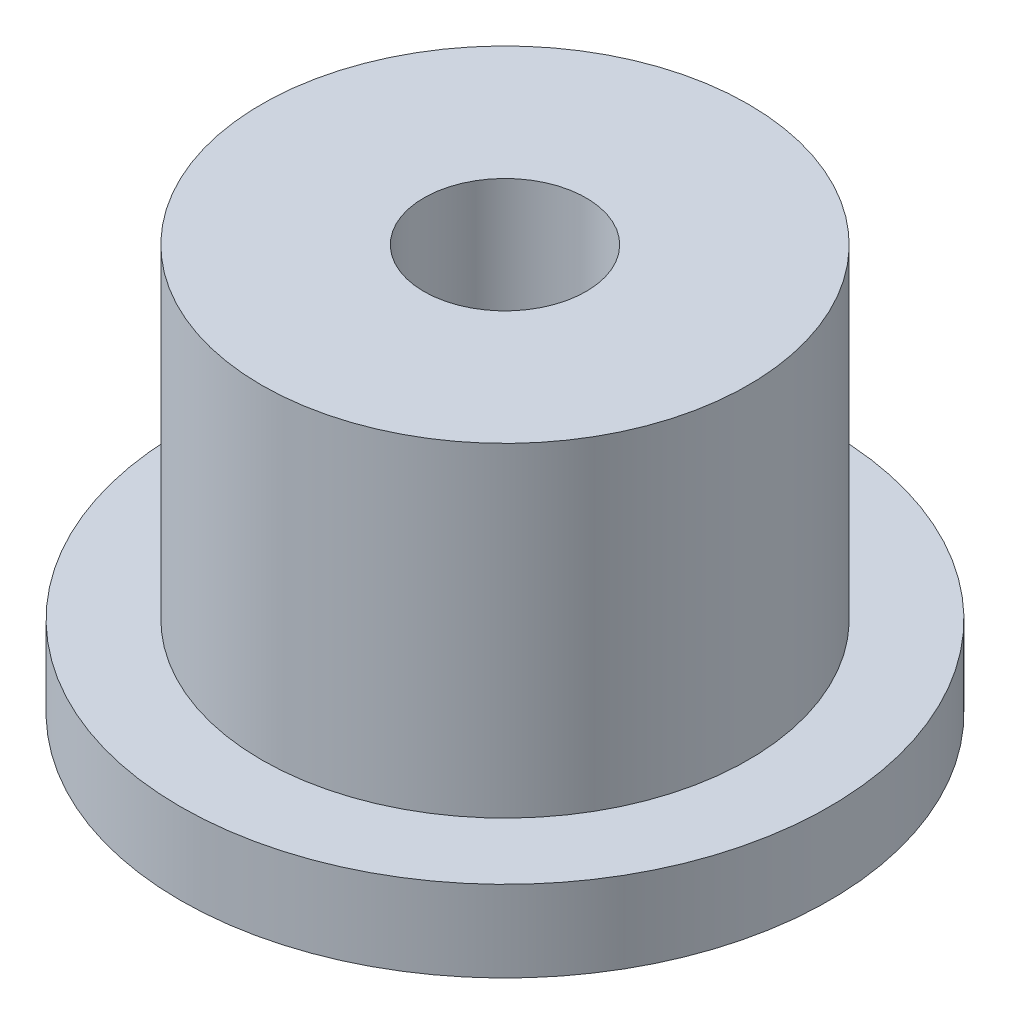
ISO-10303-21;
HEADER;
FILE_DESCRIPTION(('STEP AP214'),'2;1');
FILE_NAME('part.step','',(''),(''),'','','');
FILE_SCHEMA(('AUTOMOTIVE_DESIGN { 1 0 10303 214 1 1 1 1 }'));
ENDSEC;
DATA;
#1=APPLICATION_CONTEXT('core data for automotive mechanical design processes');
#2=APPLICATION_PROTOCOL_DEFINITION('international standard','automotive_design',2000,#1);
#3=PRODUCT_CONTEXT('',#1,'mechanical');
#4=PRODUCT('Part','Part','',(#3));
#5=PRODUCT_RELATED_PRODUCT_CATEGORY('part','',(#4));
#6=PRODUCT_DEFINITION_FORMATION('','',#4);
#7=PRODUCT_DEFINITION_CONTEXT('part definition',#1,'design');
#8=PRODUCT_DEFINITION('design','',#6,#7);
#9=PRODUCT_DEFINITION_SHAPE('','',#8);
#10=(LENGTH_UNIT() NAMED_UNIT(*) SI_UNIT(.MILLI.,.METRE.));
#11=(NAMED_UNIT(*) PLANE_ANGLE_UNIT() SI_UNIT($,.RADIAN.));
#12=(NAMED_UNIT(*) SI_UNIT($,.STERADIAN.) SOLID_ANGLE_UNIT());
#13=UNCERTAINTY_MEASURE_WITH_UNIT(LENGTH_MEASURE(1.E-05),#10,'distance_accuracy_value','');
#14=(GEOMETRIC_REPRESENTATION_CONTEXT(3) GLOBAL_UNCERTAINTY_ASSIGNED_CONTEXT((#13)) GLOBAL_UNIT_ASSIGNED_CONTEXT((#10,
#11,#12)) REPRESENTATION_CONTEXT('',''));
#15=CARTESIAN_POINT('',(0.,0.,0.));
#16=DIRECTION('',(0.,0.,1.));
#17=DIRECTION('',(1.,0.,0.));
#18=AXIS2_PLACEMENT_3D('',#15,#16,#17);
#19=CARTESIAN_POINT('',(0.,25.,0.));
#20=DIRECTION('',(0.,-1.,0.));
#21=DIRECTION('',(0.,0.,-1.));
#22=AXIS2_PLACEMENT_3D('',#19,#20,#21);
#23=CYLINDRICAL_SURFACE('',#22,100.);
#24=CARTESIAN_POINT('',(0.,25.,0.));
#25=DIRECTION('',(0.,1.,0.));
#26=DIRECTION('',(0.,0.,1.));
#27=AXIS2_PLACEMENT_3D('',#24,#25,#26);
#28=CIRCLE('',#27,100.);
#29=CARTESIAN_POINT('',(0.,25.,100.));
#30=VERTEX_POINT('',#29);
#31=EDGE_CURVE('E10',#30,#30,#28,.T.);
#32=ORIENTED_EDGE('',*,*,#31,.F.);
#33=EDGE_LOOP('',(#32));
#34=FACE_BOUND('',#33,.T.);
#35=CARTESIAN_POINT('',(0.,0.,0.));
#36=DIRECTION('',(0.,1.,0.));
#37=DIRECTION('',(0.,0.,1.));
#38=AXIS2_PLACEMENT_3D('',#35,#36,#37);
#39=CIRCLE('',#38,100.);
#40=CARTESIAN_POINT('',(0.,0.,100.));
#41=VERTEX_POINT('',#40);
#42=EDGE_CURVE('E38',#41,#41,#39,.T.);
#43=ORIENTED_EDGE('',*,*,#42,.T.);
#44=EDGE_LOOP('',(#43));
#45=FACE_BOUND('',#44,.T.);
#46=ADVANCED_FACE('F35',(#34,#45),#23,.T.);
#47=CARTESIAN_POINT('',(0.,25.,0.));
#48=DIRECTION('',(0.,1.,0.));
#49=DIRECTION('',(0.,0.,1.));
#50=AXIS2_PLACEMENT_3D('',#47,#48,#49);
#51=PLANE('',#50);
#52=CARTESIAN_POINT('',(0.,25.,0.));
#53=DIRECTION('',(0.,1.,0.));
#54=DIRECTION('',(0.,0.,1.));
#55=AXIS2_PLACEMENT_3D('',#52,#53,#54);
#56=CIRCLE('',#55,75.);
#57=CARTESIAN_POINT('',(0.,25.,75.));
#58=VERTEX_POINT('',#57);
#59=EDGE_CURVE('E42',#58,#58,#56,.T.);
#60=ORIENTED_EDGE('',*,*,#59,.F.);
#61=EDGE_LOOP('',(#60));
#62=FACE_BOUND('',#61,.T.);
#63=ORIENTED_EDGE('',*,*,#31,.T.);
#64=EDGE_LOOP('',(#63));
#65=FACE_BOUND('',#64,.T.);
#66=ADVANCED_FACE('F77',(#62,#65),#51,.T.);
#67=CARTESIAN_POINT('',(0.,0.,0.));
#68=DIRECTION('',(0.,1.,0.));
#69=DIRECTION('',(0.,0.,1.));
#70=AXIS2_PLACEMENT_3D('',#67,#68,#69);
#71=PLANE('',#70);
#72=ORIENTED_EDGE('',*,*,#42,.F.);
#73=EDGE_LOOP('',(#72));
#74=FACE_BOUND('',#73,.T.);
#75=CARTESIAN_POINT('',(0.,0.,0.));
#76=DIRECTION('',(0.,1.,0.));
#77=DIRECTION('',(0.,0.,1.));
#78=AXIS2_PLACEMENT_3D('',#75,#76,#77);
#79=CIRCLE('',#78,25.);
#80=CARTESIAN_POINT('',(0.,0.,25.));
#81=VERTEX_POINT('',#80);
#82=EDGE_CURVE('E48',#81,#81,#79,.T.);
#83=ORIENTED_EDGE('',*,*,#82,.T.);
#84=EDGE_LOOP('',(#83));
#85=FACE_BOUND('',#84,.T.);
#86=ADVANCED_FACE('F74',(#74,#85),#71,.F.);
#87=CARTESIAN_POINT('',(0.,125.,0.));
#88=DIRECTION('',(0.,-1.,0.));
#89=DIRECTION('',(0.,0.,-1.));
#90=AXIS2_PLACEMENT_3D('',#87,#88,#89);
#91=CYLINDRICAL_SURFACE('',#90,25.);
#92=CARTESIAN_POINT('',(0.,125.,0.));
#93=DIRECTION('',(0.,1.,0.));
#94=DIRECTION('',(0.,0.,1.));
#95=AXIS2_PLACEMENT_3D('',#92,#93,#94);
#96=CIRCLE('',#95,25.);
#97=CARTESIAN_POINT('',(0.,125.,25.));
#98=VERTEX_POINT('',#97);
#99=EDGE_CURVE('E51',#98,#98,#96,.T.);
#100=ORIENTED_EDGE('',*,*,#99,.T.);
#101=EDGE_LOOP('',(#100));
#102=FACE_BOUND('',#101,.T.);
#103=ORIENTED_EDGE('',*,*,#82,.F.);
#104=EDGE_LOOP('',(#103));
#105=FACE_BOUND('',#104,.T.);
#106=ADVANCED_FACE('F58',(#102,#105),#91,.F.);
#107=CARTESIAN_POINT('',(0.,125.,0.));
#108=DIRECTION('',(0.,-1.,0.));
#109=DIRECTION('',(0.,0.,-1.));
#110=AXIS2_PLACEMENT_3D('',#107,#108,#109);
#111=CYLINDRICAL_SURFACE('',#110,75.);
#112=ORIENTED_EDGE('',*,*,#59,.T.);
#113=EDGE_LOOP('',(#112));
#114=FACE_BOUND('',#113,.T.);
#115=CARTESIAN_POINT('',(0.,125.,0.));
#116=DIRECTION('',(0.,1.,0.));
#117=DIRECTION('',(0.,0.,1.));
#118=AXIS2_PLACEMENT_3D('',#115,#116,#117);
#119=CIRCLE('',#118,75.);
#120=CARTESIAN_POINT('',(0.,125.,75.));
#121=VERTEX_POINT('',#120);
#122=EDGE_CURVE('E52',#121,#121,#119,.T.);
#123=ORIENTED_EDGE('',*,*,#122,.F.);
#124=EDGE_LOOP('',(#123));
#125=FACE_BOUND('',#124,.T.);
#126=ADVANCED_FACE('F64',(#114,#125),#111,.T.);
#127=CARTESIAN_POINT('',(0.,125.,0.));
#128=DIRECTION('',(0.,1.,0.));
#129=DIRECTION('',(0.,0.,1.));
#130=AXIS2_PLACEMENT_3D('',#127,#128,#129);
#131=PLANE('',#130);
#132=ORIENTED_EDGE('',*,*,#99,.F.);
#133=EDGE_LOOP('',(#132));
#134=FACE_BOUND('',#133,.T.);
#135=ORIENTED_EDGE('',*,*,#122,.T.);
#136=EDGE_LOOP('',(#135));
#137=FACE_BOUND('',#136,.T.);
#138=ADVANCED_FACE('F61',(#134,#137),#131,.T.);
#139=CLOSED_SHELL('',(#46,#66,#86,#106,#126,#138));
#140=MANIFOLD_SOLID_BREP('B2',#139);
#141=ADVANCED_BREP_SHAPE_REPRESENTATION('',(#18,#140),#14);
#142=SHAPE_DEFINITION_REPRESENTATION(#9,#141);
ENDSEC;
END-ISO-10303-21;
